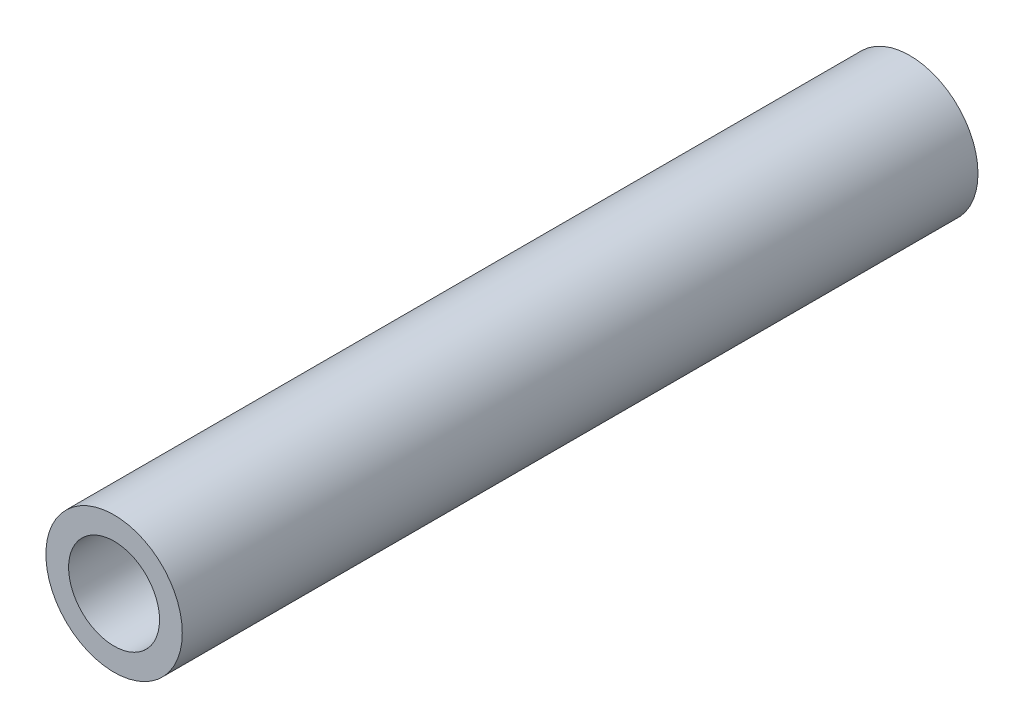
ISO-10303-21;
HEADER;
FILE_DESCRIPTION(('STEP AP214'),'2;1');
FILE_NAME('part.step','',(''),(''),'','','');
FILE_SCHEMA(('AUTOMOTIVE_DESIGN { 1 0 10303 214 1 1 1 1 }'));
ENDSEC;
DATA;
#1=APPLICATION_CONTEXT('core data for automotive mechanical design processes');
#2=APPLICATION_PROTOCOL_DEFINITION('international standard','automotive_design',2000,#1);
#3=PRODUCT_CONTEXT('',#1,'mechanical');
#4=PRODUCT('Part','Part','',(#3));
#5=PRODUCT_RELATED_PRODUCT_CATEGORY('part','',(#4));
#6=PRODUCT_DEFINITION_FORMATION('','',#4);
#7=PRODUCT_DEFINITION_CONTEXT('part definition',#1,'design');
#8=PRODUCT_DEFINITION('design','',#6,#7);
#9=PRODUCT_DEFINITION_SHAPE('','',#8);
#10=(LENGTH_UNIT() NAMED_UNIT(*) SI_UNIT(.MILLI.,.METRE.));
#11=(NAMED_UNIT(*) PLANE_ANGLE_UNIT() SI_UNIT($,.RADIAN.));
#12=(NAMED_UNIT(*) SI_UNIT($,.STERADIAN.) SOLID_ANGLE_UNIT());
#13=UNCERTAINTY_MEASURE_WITH_UNIT(LENGTH_MEASURE(1.E-05),#10,'distance_accuracy_value','');
#14=(GEOMETRIC_REPRESENTATION_CONTEXT(3) GLOBAL_UNCERTAINTY_ASSIGNED_CONTEXT((#13)) GLOBAL_UNIT_ASSIGNED_CONTEXT((#10,
#11,#12)) REPRESENTATION_CONTEXT('',''));
#15=CARTESIAN_POINT('',(0.,0.,0.));
#16=DIRECTION('',(0.,0.,1.));
#17=DIRECTION('',(1.,0.,0.));
#18=AXIS2_PLACEMENT_3D('',#15,#16,#17);
#19=CARTESIAN_POINT('',(215.,-26.4239385297091,43.4852813742386));
#20=DIRECTION('',(0.,0.,-1.));
#21=DIRECTION('',(-1.,0.,0.));
#22=AXIS2_PLACEMENT_3D('',#19,#20,#21);
#23=CYLINDRICAL_SURFACE('',#22,2.99999999999999);
#24=CARTESIAN_POINT('',(215.,-26.4239385297091,0.));
#25=DIRECTION('',(0.,0.,1.));
#26=DIRECTION('',(1.,0.,0.));
#27=AXIS2_PLACEMENT_3D('',#24,#25,#26);
#28=CIRCLE('',#27,2.99999999999999);
#29=CARTESIAN_POINT('',(218.,-26.4239385297091,0.));
#30=VERTEX_POINT('',#29);
#31=EDGE_CURVE('E42',#30,#30,#28,.T.);
#32=ORIENTED_EDGE('',*,*,#31,.T.);
#33=EDGE_LOOP('',(#32));
#34=FACE_BOUND('',#33,.T.);
#35=CARTESIAN_POINT('',(215.,-26.4239385297091,35.));
#36=DIRECTION('',(0.,0.,1.));
#37=DIRECTION('',(1.,0.,0.));
#38=AXIS2_PLACEMENT_3D('',#35,#36,#37);
#39=CIRCLE('',#38,2.99999999999999);
#40=CARTESIAN_POINT('',(218.,-26.4239385297091,35.));
#41=VERTEX_POINT('',#40);
#42=EDGE_CURVE('E10',#41,#41,#39,.T.);
#43=ORIENTED_EDGE('',*,*,#42,.F.);
#44=EDGE_LOOP('',(#43));
#45=FACE_BOUND('',#44,.T.);
#46=ADVANCED_FACE('F31',(#34,#45),#23,.T.);
#47=CARTESIAN_POINT('',(215.,-26.4239385297091,0.));
#48=DIRECTION('',(0.,0.,1.));
#49=DIRECTION('',(1.,0.,0.));
#50=AXIS2_PLACEMENT_3D('',#47,#48,#49);
#51=PLANE('',#50);
#52=ORIENTED_EDGE('',*,*,#31,.F.);
#53=EDGE_LOOP('',(#52));
#54=FACE_BOUND('',#53,.T.);
#55=CARTESIAN_POINT('',(215.,-26.4239385297091,0.));
#56=DIRECTION('',(0.,0.,1.));
#57=DIRECTION('',(1.,0.,0.));
#58=AXIS2_PLACEMENT_3D('',#55,#56,#57);
#59=CIRCLE('',#58,2.);
#60=CARTESIAN_POINT('',(217.,-26.4239385297091,0.));
#61=VERTEX_POINT('',#60);
#62=EDGE_CURVE('E44',#61,#61,#59,.T.);
#63=ORIENTED_EDGE('',*,*,#62,.T.);
#64=EDGE_LOOP('',(#63));
#65=FACE_BOUND('',#64,.T.);
#66=ADVANCED_FACE('F51',(#54,#65),#51,.F.);
#67=CARTESIAN_POINT('',(215.,-26.4239385297091,43.4852813742386));
#68=DIRECTION('',(0.,0.,-1.));
#69=DIRECTION('',(-1.,0.,0.));
#70=AXIS2_PLACEMENT_3D('',#67,#68,#69);
#71=CYLINDRICAL_SURFACE('',#70,2.);
#72=ORIENTED_EDGE('',*,*,#62,.F.);
#73=EDGE_LOOP('',(#72));
#74=FACE_BOUND('',#73,.T.);
#75=CARTESIAN_POINT('',(215.,-26.4239385297091,35.));
#76=DIRECTION('',(0.,0.,1.));
#77=DIRECTION('',(1.,0.,0.));
#78=AXIS2_PLACEMENT_3D('',#75,#76,#77);
#79=CIRCLE('',#78,2.);
#80=CARTESIAN_POINT('',(217.,-26.4239385297091,35.));
#81=VERTEX_POINT('',#80);
#82=EDGE_CURVE('E34',#81,#81,#79,.T.);
#83=ORIENTED_EDGE('',*,*,#82,.T.);
#84=EDGE_LOOP('',(#83));
#85=FACE_BOUND('',#84,.T.);
#86=ADVANCED_FACE('F54',(#74,#85),#71,.F.);
#87=CARTESIAN_POINT('',(144.,0.,35.));
#88=DIRECTION('',(0.,0.,1.));
#89=DIRECTION('',(-1.,0.,0.));
#90=AXIS2_PLACEMENT_3D('',#87,#88,#89);
#91=PLANE('',#90);
#92=ORIENTED_EDGE('',*,*,#82,.F.);
#93=EDGE_LOOP('',(#92));
#94=FACE_BOUND('',#93,.T.);
#95=ORIENTED_EDGE('',*,*,#42,.T.);
#96=EDGE_LOOP('',(#95));
#97=FACE_BOUND('',#96,.T.);
#98=ADVANCED_FACE('F59',(#94,#97),#91,.T.);
#99=CLOSED_SHELL('',(#46,#66,#86,#98));
#100=MANIFOLD_SOLID_BREP('B2',#99);
#101=ADVANCED_BREP_SHAPE_REPRESENTATION('',(#18,#100),#14);
#102=SHAPE_DEFINITION_REPRESENTATION(#9,#101);
ENDSEC;
END-ISO-10303-21;
